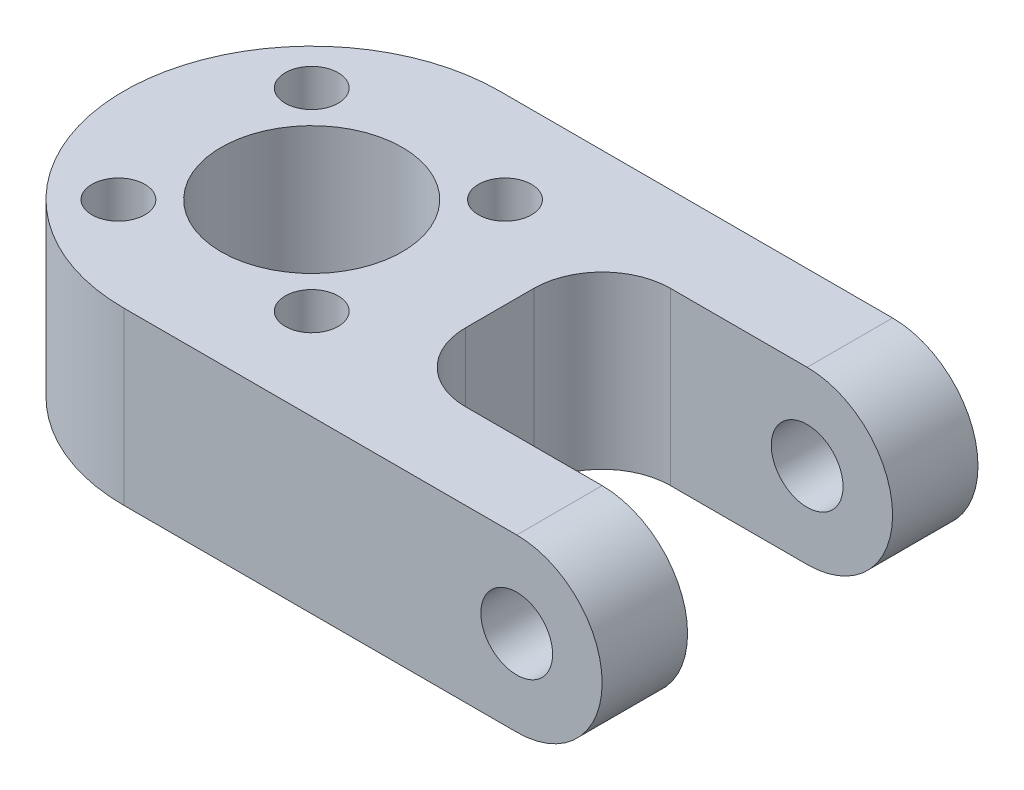
ISO-10303-21;
HEADER;
FILE_DESCRIPTION(('STEP AP214'),'2;1');
FILE_NAME('part.step','',(''),(''),'','','');
FILE_SCHEMA(('AUTOMOTIVE_DESIGN { 1 0 10303 214 1 1 1 1 }'));
ENDSEC;
DATA;
#1=APPLICATION_CONTEXT('core data for automotive mechanical design processes');
#2=APPLICATION_PROTOCOL_DEFINITION('international standard','automotive_design',2000,#1);
#3=PRODUCT_CONTEXT('',#1,'mechanical');
#4=PRODUCT('Part','Part','',(#3));
#5=PRODUCT_RELATED_PRODUCT_CATEGORY('part','',(#4));
#6=PRODUCT_DEFINITION_FORMATION('','',#4);
#7=PRODUCT_DEFINITION_CONTEXT('part definition',#1,'design');
#8=PRODUCT_DEFINITION('design','',#6,#7);
#9=PRODUCT_DEFINITION_SHAPE('','',#8);
#10=(LENGTH_UNIT() NAMED_UNIT(*) SI_UNIT(.MILLI.,.METRE.));
#11=(NAMED_UNIT(*) PLANE_ANGLE_UNIT() SI_UNIT($,.RADIAN.));
#12=(NAMED_UNIT(*) SI_UNIT($,.STERADIAN.) SOLID_ANGLE_UNIT());
#13=UNCERTAINTY_MEASURE_WITH_UNIT(LENGTH_MEASURE(1.E-05),#10,'distance_accuracy_value','');
#14=(GEOMETRIC_REPRESENTATION_CONTEXT(3) GLOBAL_UNCERTAINTY_ASSIGNED_CONTEXT((#13)) GLOBAL_UNIT_ASSIGNED_CONTEXT((#10,
#11,#12)) REPRESENTATION_CONTEXT('',''));
#15=CARTESIAN_POINT('',(0.,0.,0.));
#16=DIRECTION('',(0.,0.,1.));
#17=DIRECTION('',(1.,0.,0.));
#18=AXIS2_PLACEMENT_3D('',#15,#16,#17);
#19=CARTESIAN_POINT('',(-28.,10.,-11.0000000000001));
#20=DIRECTION('',(0.,0.,-1.));
#21=DIRECTION('',(-1.,0.,0.));
#22=AXIS2_PLACEMENT_3D('',#19,#20,#21);
#23=PLANE('',#22);
#24=CARTESIAN_POINT('',(-5.,5.,-11.0000000000001));
#25=DIRECTION('',(0.,0.,1.));
#26=DIRECTION('',(1.,0.,0.));
#27=AXIS2_PLACEMENT_3D('',#24,#25,#26);
#28=CIRCLE('',#27,2.1);
#29=CARTESIAN_POINT('',(-2.9,5.,-11.0000000000001));
#30=VERTEX_POINT('',#29);
#31=EDGE_CURVE('E519',#30,#30,#28,.T.);
#32=ORIENTED_EDGE('',*,*,#31,.T.);
#33=EDGE_LOOP('',(#32));
#34=FACE_BOUND('',#33,.T.);
#35=CARTESIAN_POINT('',(-5.,5.,-11.0000000000001));
#36=DIRECTION('',(0.,0.,1.));
#37=DIRECTION('',(1.,0.,0.));
#38=AXIS2_PLACEMENT_3D('',#35,#36,#37);
#39=CIRCLE('',#38,5.);
#40=CARTESIAN_POINT('',(-5.,0.,-11.0000000000001));
#41=VERTEX_POINT('',#40);
#42=CARTESIAN_POINT('',(-5.,10.,-11.0000000000001));
#43=VERTEX_POINT('',#42);
#44=EDGE_CURVE('E301',#41,#43,#39,.T.);
#45=ORIENTED_EDGE('',*,*,#44,.F.);
#46=DIRECTION('',(1.,0.,0.));
#47=VECTOR('',#46,1.);
#48=CARTESIAN_POINT('',(-28.,0.,-11.0000000000001));
#49=LINE('',#48,#47);
#50=CARTESIAN_POINT('',(-28.,0.,-11.0000000000001));
#51=VERTEX_POINT('',#50);
#52=EDGE_CURVE('E304',#51,#41,#49,.T.);
#53=ORIENTED_EDGE('',*,*,#52,.F.);
#54=DIRECTION('',(0.,-1.,0.));
#55=VECTOR('',#54,1.);
#56=CARTESIAN_POINT('',(-28.,10.,-11.0000000000001));
#57=LINE('',#56,#55);
#58=CARTESIAN_POINT('',(-28.,10.,-11.0000000000001));
#59=VERTEX_POINT('',#58);
#60=EDGE_CURVE('E359',#59,#51,#57,.T.);
#61=ORIENTED_EDGE('',*,*,#60,.F.);
#62=DIRECTION('',(1.,0.,0.));
#63=VECTOR('',#62,1.);
#64=CARTESIAN_POINT('',(-28.,10.,-11.0000000000001));
#65=LINE('',#64,#63);
#66=EDGE_CURVE('E306',#59,#43,#65,.T.);
#67=ORIENTED_EDGE('',*,*,#66,.T.);
#68=EDGE_LOOP('',(#45,#53,#61,#67));
#69=FACE_BOUND('',#68,.T.);
#70=ADVANCED_FACE('F223',(#34,#69),#23,.T.);
#71=CARTESIAN_POINT('',(-28.,10.,10.9999999999999));
#72=DIRECTION('',(0.,0.,-1.));
#73=DIRECTION('',(-1.,0.,0.));
#74=AXIS2_PLACEMENT_3D('',#71,#72,#73);
#75=PLANE('',#74);
#76=CARTESIAN_POINT('',(-5.,5.,10.9999999999999));
#77=DIRECTION('',(0.,0.,1.));
#78=DIRECTION('',(1.,0.,0.));
#79=AXIS2_PLACEMENT_3D('',#76,#77,#78);
#80=CIRCLE('',#79,2.1);
#81=CARTESIAN_POINT('',(-2.9,5.,10.9999999999999));
#82=VERTEX_POINT('',#81);
#83=EDGE_CURVE('E521',#82,#82,#80,.T.);
#84=ORIENTED_EDGE('',*,*,#83,.F.);
#85=EDGE_LOOP('',(#84));
#86=FACE_BOUND('',#85,.T.);
#87=DIRECTION('',(1.,0.,0.));
#88=VECTOR('',#87,1.);
#89=CARTESIAN_POINT('',(-28.,0.,10.9999999999999));
#90=LINE('',#89,#88);
#91=CARTESIAN_POINT('',(-28.,0.,10.9999999999999));
#92=VERTEX_POINT('',#91);
#93=CARTESIAN_POINT('',(-5.,0.,10.9999999999999));
#94=VERTEX_POINT('',#93);
#95=EDGE_CURVE('E353',#92,#94,#90,.T.);
#96=ORIENTED_EDGE('',*,*,#95,.T.);
#97=CARTESIAN_POINT('',(-5.,5.,10.9999999999999));
#98=DIRECTION('',(0.,0.,1.));
#99=DIRECTION('',(1.,0.,0.));
#100=AXIS2_PLACEMENT_3D('',#97,#98,#99);
#101=CIRCLE('',#100,5.);
#102=CARTESIAN_POINT('',(-5.,10.,10.9999999999999));
#103=VERTEX_POINT('',#102);
#104=EDGE_CURVE('E312',#94,#103,#101,.T.);
#105=ORIENTED_EDGE('',*,*,#104,.T.);
#106=DIRECTION('',(1.,0.,0.));
#107=VECTOR('',#106,1.);
#108=CARTESIAN_POINT('',(-28.,10.,10.9999999999999));
#109=LINE('',#108,#107);
#110=CARTESIAN_POINT('',(-28.,10.,10.9999999999999));
#111=VERTEX_POINT('',#110);
#112=EDGE_CURVE('E401',#111,#103,#109,.T.);
#113=ORIENTED_EDGE('',*,*,#112,.F.);
#114=DIRECTION('',(0.,-1.,0.));
#115=VECTOR('',#114,1.);
#116=CARTESIAN_POINT('',(-28.,10.,10.9999999999999));
#117=LINE('',#116,#115);
#118=EDGE_CURVE('E363',#111,#92,#117,.T.);
#119=ORIENTED_EDGE('',*,*,#118,.T.);
#120=EDGE_LOOP('',(#96,#105,#113,#119));
#121=FACE_BOUND('',#120,.T.);
#122=ADVANCED_FACE('F420',(#86,#121),#75,.F.);
#123=CARTESIAN_POINT('',(0.,10.,5.99999999999994));
#124=DIRECTION('',(0.,0.,1.));
#125=DIRECTION('',(1.,0.,0.));
#126=AXIS2_PLACEMENT_3D('',#123,#124,#125);
#127=PLANE('',#126);
#128=CARTESIAN_POINT('',(-5.,5.,5.99999999999994));
#129=DIRECTION('',(0.,0.,1.));
#130=DIRECTION('',(1.,0.,0.));
#131=AXIS2_PLACEMENT_3D('',#128,#129,#130);
#132=CIRCLE('',#131,2.1);
#133=CARTESIAN_POINT('',(-2.9,5.,5.99999999999994));
#134=VERTEX_POINT('',#133);
#135=EDGE_CURVE('E370',#134,#134,#132,.T.);
#136=ORIENTED_EDGE('',*,*,#135,.T.);
#137=EDGE_LOOP('',(#136));
#138=FACE_BOUND('',#137,.T.);
#139=DIRECTION('',(-1.,0.,0.));
#140=VECTOR('',#139,1.);
#141=CARTESIAN_POINT('',(0.,0.,5.99999999999994));
#142=LINE('',#141,#140);
#143=CARTESIAN_POINT('',(-5.,0.,5.99999999999994));
#144=VERTEX_POINT('',#143);
#145=CARTESIAN_POINT('',(-13.,0.,5.99999999999994));
#146=VERTEX_POINT('',#145);
#147=EDGE_CURVE('E350',#144,#146,#142,.T.);
#148=ORIENTED_EDGE('',*,*,#147,.T.);
#149=DIRECTION('',(0.,-1.,0.));
#150=VECTOR('',#149,1.);
#151=CARTESIAN_POINT('',(-13.,10.,5.99999999999994));
#152=LINE('',#151,#150);
#153=CARTESIAN_POINT('',(-13.,10.,5.99999999999994));
#154=VERTEX_POINT('',#153);
#155=EDGE_CURVE('E239',#146,#154,#152,.F.);
#156=ORIENTED_EDGE('',*,*,#155,.T.);
#157=DIRECTION('',(-1.,0.,0.));
#158=VECTOR('',#157,1.);
#159=CARTESIAN_POINT('',(0.,10.,5.99999999999994));
#160=LINE('',#159,#158);
#161=CARTESIAN_POINT('',(-5.,10.,5.99999999999994));
#162=VERTEX_POINT('',#161);
#163=EDGE_CURVE('E394',#162,#154,#160,.T.);
#164=ORIENTED_EDGE('',*,*,#163,.F.);
#165=CARTESIAN_POINT('',(-5.,5.,5.99999999999994));
#166=DIRECTION('',(0.,0.,1.));
#167=DIRECTION('',(1.,0.,0.));
#168=AXIS2_PLACEMENT_3D('',#165,#166,#167);
#169=CIRCLE('',#168,5.);
#170=EDGE_CURVE('E434',#144,#162,#169,.T.);
#171=ORIENTED_EDGE('',*,*,#170,.F.);
#172=EDGE_LOOP('',(#148,#156,#164,#171));
#173=FACE_BOUND('',#172,.T.);
#174=ADVANCED_FACE('F494',(#138,#173),#127,.F.);
#175=CARTESIAN_POINT('',(-17.,10.,-6.00000000000006));
#176=DIRECTION('',(0.,0.,-1.));
#177=DIRECTION('',(-1.,0.,0.));
#178=AXIS2_PLACEMENT_3D('',#175,#176,#177);
#179=PLANE('',#178);
#180=CARTESIAN_POINT('',(-5.,5.,-6.00000000000006));
#181=DIRECTION('',(0.,0.,-1.));
#182=DIRECTION('',(-1.,0.,0.));
#183=AXIS2_PLACEMENT_3D('',#180,#181,#182);
#184=CIRCLE('',#183,2.1);
#185=CARTESIAN_POINT('',(-7.1,5.,-6.00000000000006));
#186=VERTEX_POINT('',#185);
#187=EDGE_CURVE('E322',#186,#186,#184,.T.);
#188=ORIENTED_EDGE('',*,*,#187,.T.);
#189=EDGE_LOOP('',(#188));
#190=FACE_BOUND('',#189,.T.);
#191=DIRECTION('',(1.,0.,0.));
#192=VECTOR('',#191,1.);
#193=CARTESIAN_POINT('',(-17.,10.,-6.00000000000006));
#194=LINE('',#193,#192);
#195=CARTESIAN_POINT('',(-13.,10.,-6.00000000000006));
#196=VERTEX_POINT('',#195);
#197=CARTESIAN_POINT('',(-5.,10.,-6.00000000000006));
#198=VERTEX_POINT('',#197);
#199=EDGE_CURVE('E395',#196,#198,#194,.T.);
#200=ORIENTED_EDGE('',*,*,#199,.F.);
#201=DIRECTION('',(0.,-1.,0.));
#202=VECTOR('',#201,1.);
#203=CARTESIAN_POINT('',(-13.,0.,-6.00000000000006));
#204=LINE('',#203,#202);
#205=CARTESIAN_POINT('',(-13.,0.,-6.00000000000006));
#206=VERTEX_POINT('',#205);
#207=EDGE_CURVE('E362',#196,#206,#204,.T.);
#208=ORIENTED_EDGE('',*,*,#207,.T.);
#209=DIRECTION('',(1.,0.,0.));
#210=VECTOR('',#209,1.);
#211=CARTESIAN_POINT('',(-17.,0.,-6.00000000000006));
#212=LINE('',#211,#210);
#213=CARTESIAN_POINT('',(-5.,0.,-6.00000000000006));
#214=VERTEX_POINT('',#213);
#215=EDGE_CURVE('E331',#206,#214,#212,.T.);
#216=ORIENTED_EDGE('',*,*,#215,.T.);
#217=CARTESIAN_POINT('',(-5.,5.,-6.00000000000006));
#218=DIRECTION('',(0.,0.,-1.));
#219=DIRECTION('',(-1.,0.,0.));
#220=AXIS2_PLACEMENT_3D('',#217,#218,#219);
#221=CIRCLE('',#220,5.);
#222=EDGE_CURVE('E319',#198,#214,#221,.T.);
#223=ORIENTED_EDGE('',*,*,#222,.F.);
#224=EDGE_LOOP('',(#200,#208,#216,#223));
#225=FACE_BOUND('',#224,.T.);
#226=ADVANCED_FACE('F499',(#190,#225),#179,.F.);
#227=CARTESIAN_POINT('',(-28.,10.,0.));
#228=DIRECTION('',(0.,1.,0.));
#229=DIRECTION('',(0.,0.,1.));
#230=AXIS2_PLACEMENT_3D('',#227,#228,#229);
#231=PLANE('',#230);
#232=DIRECTION('',(0.,0.,1.));
#233=VECTOR('',#232,1.);
#234=CARTESIAN_POINT('',(-5.,10.,-11.0000000000001));
#235=LINE('',#234,#233);
#236=EDGE_CURVE('E430',#43,#198,#235,.T.);
#237=ORIENTED_EDGE('',*,*,#236,.F.);
#238=ORIENTED_EDGE('',*,*,#66,.F.);
#239=CARTESIAN_POINT('',(-28.,10.,0.));
#240=DIRECTION('',(0.,1.,0.));
#241=DIRECTION('',(0.,0.,1.));
#242=AXIS2_PLACEMENT_3D('',#239,#240,#241);
#243=CIRCLE('',#242,11.);
#244=EDGE_CURVE('E344',#59,#111,#243,.T.);
#245=ORIENTED_EDGE('',*,*,#244,.T.);
#246=ORIENTED_EDGE('',*,*,#112,.T.);
#247=EDGE_CURVE('E311',#162,#103,#235,.T.);
#248=ORIENTED_EDGE('',*,*,#247,.F.);
#249=ORIENTED_EDGE('',*,*,#163,.T.);
#250=CARTESIAN_POINT('',(-13.,10.,1.99999999999994));
#251=DIRECTION('',(0.,1.,0.));
#252=DIRECTION('',(0.,0.,1.));
#253=AXIS2_PLACEMENT_3D('',#250,#251,#252);
#254=CIRCLE('',#253,4.);
#255=CARTESIAN_POINT('',(-17.,10.,1.99999999999994));
#256=VERTEX_POINT('',#255);
#257=EDGE_CURVE('E12',#154,#256,#254,.F.);
#258=ORIENTED_EDGE('',*,*,#257,.T.);
#259=DIRECTION('',(0.,0.,-1.));
#260=VECTOR('',#259,1.);
#261=CARTESIAN_POINT('',(-17.,10.,5.99999999999994));
#262=LINE('',#261,#260);
#263=CARTESIAN_POINT('',(-17.,10.,-2.00000000000006));
#264=VERTEX_POINT('',#263);
#265=EDGE_CURVE('E392',#256,#264,#262,.T.);
#266=ORIENTED_EDGE('',*,*,#265,.T.);
#267=CARTESIAN_POINT('',(-13.,10.,-2.00000000000006));
#268=DIRECTION('',(0.,1.,0.));
#269=DIRECTION('',(0.,0.,1.));
#270=AXIS2_PLACEMENT_3D('',#267,#268,#269);
#271=CIRCLE('',#270,4.);
#272=EDGE_CURVE('E386',#264,#196,#271,.F.);
#273=ORIENTED_EDGE('',*,*,#272,.T.);
#274=ORIENTED_EDGE('',*,*,#199,.T.);
#275=EDGE_LOOP('',(#237,#238,#245,#246,#248,#249,#258,#266,#273,#274));
#276=FACE_BOUND('',#275,.T.);
#277=CARTESIAN_POINT('',(-22.3431457505076,10.,-5.65685424949245));
#278=DIRECTION('',(0.,1.,0.));
#279=DIRECTION('',(0.,0.,1.));
#280=AXIS2_PLACEMENT_3D('',#277,#278,#279);
#281=CIRCLE('',#280,1.54999999999999);
#282=CARTESIAN_POINT('',(-22.3431457505076,10.,-4.10685424949245));
#283=VERTEX_POINT('',#282);
#284=EDGE_CURVE('E445',#283,#283,#281,.T.);
#285=ORIENTED_EDGE('',*,*,#284,.F.);
#286=EDGE_LOOP('',(#285));
#287=FACE_BOUND('',#286,.T.);
#288=CARTESIAN_POINT('',(-33.6568542494924,10.,5.65685424949234));
#289=DIRECTION('',(0.,1.,0.));
#290=DIRECTION('',(0.,0.,1.));
#291=AXIS2_PLACEMENT_3D('',#288,#289,#290);
#292=CIRCLE('',#291,1.54999999999999);
#293=CARTESIAN_POINT('',(-33.6568542494924,10.,7.20685424949233));
#294=VERTEX_POINT('',#293);
#295=EDGE_CURVE('E460',#294,#294,#292,.T.);
#296=ORIENTED_EDGE('',*,*,#295,.F.);
#297=EDGE_LOOP('',(#296));
#298=FACE_BOUND('',#297,.T.);
#299=CARTESIAN_POINT('',(-28.,10.,0.));
#300=DIRECTION('',(0.,1.,0.));
#301=DIRECTION('',(0.,0.,1.));
#302=AXIS2_PLACEMENT_3D('',#299,#300,#301);
#303=CIRCLE('',#302,5.3);
#304=CARTESIAN_POINT('',(-28.,10.,5.29999999999995));
#305=VERTEX_POINT('',#304);
#306=EDGE_CURVE('E332',#305,#305,#303,.T.);
#307=ORIENTED_EDGE('',*,*,#306,.F.);
#308=EDGE_LOOP('',(#307));
#309=FACE_BOUND('',#308,.T.);
#310=CARTESIAN_POINT('',(-22.3431457505076,10.,5.65685424949231));
#311=DIRECTION('',(0.,1.,0.));
#312=DIRECTION('',(0.,0.,1.));
#313=AXIS2_PLACEMENT_3D('',#310,#311,#312);
#314=CIRCLE('',#313,1.55);
#315=CARTESIAN_POINT('',(-22.3431457505076,10.,7.20685424949232));
#316=VERTEX_POINT('',#315);
#317=EDGE_CURVE('E453',#316,#316,#314,.T.);
#318=ORIENTED_EDGE('',*,*,#317,.F.);
#319=EDGE_LOOP('',(#318));
#320=FACE_BOUND('',#319,.T.);
#321=CARTESIAN_POINT('',(-33.6568542494924,10.,-5.65685424949241));
#322=DIRECTION('',(0.,1.,0.));
#323=DIRECTION('',(0.,0.,1.));
#324=AXIS2_PLACEMENT_3D('',#321,#322,#323);
#325=CIRCLE('',#324,1.54999999999999);
#326=CARTESIAN_POINT('',(-33.6568542494924,10.,-4.10685424949243));
#327=VERTEX_POINT('',#326);
#328=EDGE_CURVE('E438',#327,#327,#325,.T.);
#329=ORIENTED_EDGE('',*,*,#328,.F.);
#330=EDGE_LOOP('',(#329));
#331=FACE_BOUND('',#330,.T.);
#332=ADVANCED_FACE('F414',(#276,#287,#298,#309,#320,#331),#231,.T.);
#333=CARTESIAN_POINT('',(-28.,0.,0.));
#334=DIRECTION('',(0.,1.,0.));
#335=DIRECTION('',(0.,0.,1.));
#336=AXIS2_PLACEMENT_3D('',#333,#334,#335);
#337=PLANE('',#336);
#338=ORIENTED_EDGE('',*,*,#52,.T.);
#339=DIRECTION('',(0.,0.,1.));
#340=VECTOR('',#339,1.);
#341=CARTESIAN_POINT('',(-5.,0.,-11.0000000000001));
#342=LINE('',#341,#340);
#343=EDGE_CURVE('E316',#41,#214,#342,.T.);
#344=ORIENTED_EDGE('',*,*,#343,.T.);
#345=ORIENTED_EDGE('',*,*,#215,.F.);
#346=CARTESIAN_POINT('',(-13.,0.,-2.00000000000006));
#347=DIRECTION('',(0.,1.,0.));
#348=DIRECTION('',(0.,0.,1.));
#349=AXIS2_PLACEMENT_3D('',#346,#347,#348);
#350=CIRCLE('',#349,4.);
#351=CARTESIAN_POINT('',(-17.,0.,-2.00000000000006));
#352=VERTEX_POINT('',#351);
#353=EDGE_CURVE('E383',#206,#352,#350,.T.);
#354=ORIENTED_EDGE('',*,*,#353,.T.);
#355=DIRECTION('',(0.,0.,-1.));
#356=VECTOR('',#355,1.);
#357=CARTESIAN_POINT('',(-17.,0.,5.99999999999994));
#358=LINE('',#357,#356);
#359=CARTESIAN_POINT('',(-17.,0.,1.99999999999994));
#360=VERTEX_POINT('',#359);
#361=EDGE_CURVE('E337',#360,#352,#358,.T.);
#362=ORIENTED_EDGE('',*,*,#361,.F.);
#363=CARTESIAN_POINT('',(-13.,0.,1.99999999999994));
#364=DIRECTION('',(0.,1.,0.));
#365=DIRECTION('',(0.,0.,1.));
#366=AXIS2_PLACEMENT_3D('',#363,#364,#365);
#367=CIRCLE('',#366,4.);
#368=EDGE_CURVE('E232',#360,#146,#367,.T.);
#369=ORIENTED_EDGE('',*,*,#368,.T.);
#370=ORIENTED_EDGE('',*,*,#147,.F.);
#371=EDGE_CURVE('E323',#144,#94,#342,.T.);
#372=ORIENTED_EDGE('',*,*,#371,.T.);
#373=ORIENTED_EDGE('',*,*,#95,.F.);
#374=CARTESIAN_POINT('',(-28.,0.,0.));
#375=DIRECTION('',(0.,1.,0.));
#376=DIRECTION('',(0.,0.,1.));
#377=AXIS2_PLACEMENT_3D('',#374,#375,#376);
#378=CIRCLE('',#377,11.);
#379=EDGE_CURVE('E329',#51,#92,#378,.T.);
#380=ORIENTED_EDGE('',*,*,#379,.F.);
#381=EDGE_LOOP('',(#338,#344,#345,#354,#362,#369,#370,#372,#373,#380));
#382=FACE_BOUND('',#381,.T.);
#383=CARTESIAN_POINT('',(-28.,0.,0.));
#384=DIRECTION('',(0.,1.,0.));
#385=DIRECTION('',(0.,0.,1.));
#386=AXIS2_PLACEMENT_3D('',#383,#384,#385);
#387=CIRCLE('',#386,5.3);
#388=CARTESIAN_POINT('',(-28.,0.,5.29999999999995));
#389=VERTEX_POINT('',#388);
#390=EDGE_CURVE('E341',#389,#389,#387,.T.);
#391=ORIENTED_EDGE('',*,*,#390,.T.);
#392=EDGE_LOOP('',(#391));
#393=FACE_BOUND('',#392,.T.);
#394=CARTESIAN_POINT('',(-33.6568542494924,0.,5.65685424949234));
#395=DIRECTION('',(0.,1.,0.));
#396=DIRECTION('',(0.,0.,1.));
#397=AXIS2_PLACEMENT_3D('',#394,#395,#396);
#398=CIRCLE('',#397,1.54999999999999);
#399=CARTESIAN_POINT('',(-33.6568542494924,0.,7.20685424949233));
#400=VERTEX_POINT('',#399);
#401=EDGE_CURVE('E456',#400,#400,#398,.T.);
#402=ORIENTED_EDGE('',*,*,#401,.T.);
#403=EDGE_LOOP('',(#402));
#404=FACE_BOUND('',#403,.T.);
#405=CARTESIAN_POINT('',(-22.3431457505076,0.,5.65685424949231));
#406=DIRECTION('',(0.,1.,0.));
#407=DIRECTION('',(0.,0.,1.));
#408=AXIS2_PLACEMENT_3D('',#405,#406,#407);
#409=CIRCLE('',#408,1.55);
#410=CARTESIAN_POINT('',(-22.3431457505076,0.,7.20685424949232));
#411=VERTEX_POINT('',#410);
#412=EDGE_CURVE('E449',#411,#411,#409,.T.);
#413=ORIENTED_EDGE('',*,*,#412,.T.);
#414=EDGE_LOOP('',(#413));
#415=FACE_BOUND('',#414,.T.);
#416=CARTESIAN_POINT('',(-22.3431457505076,0.,-5.65685424949245));
#417=DIRECTION('',(0.,1.,0.));
#418=DIRECTION('',(0.,0.,1.));
#419=AXIS2_PLACEMENT_3D('',#416,#417,#418);
#420=CIRCLE('',#419,1.54999999999999);
#421=CARTESIAN_POINT('',(-22.3431457505076,0.,-4.10685424949245));
#422=VERTEX_POINT('',#421);
#423=EDGE_CURVE('E442',#422,#422,#420,.T.);
#424=ORIENTED_EDGE('',*,*,#423,.T.);
#425=EDGE_LOOP('',(#424));
#426=FACE_BOUND('',#425,.T.);
#427=CARTESIAN_POINT('',(-33.6568542494924,0.,-5.65685424949241));
#428=DIRECTION('',(0.,1.,0.));
#429=DIRECTION('',(0.,0.,1.));
#430=AXIS2_PLACEMENT_3D('',#427,#428,#429);
#431=CIRCLE('',#430,1.54999999999999);
#432=CARTESIAN_POINT('',(-33.6568542494924,0.,-4.10685424949243));
#433=VERTEX_POINT('',#432);
#434=EDGE_CURVE('E437',#433,#433,#431,.T.);
#435=ORIENTED_EDGE('',*,*,#434,.T.);
#436=EDGE_LOOP('',(#435));
#437=FACE_BOUND('',#436,.T.);
#438=ADVANCED_FACE('F326',(#382,#393,#404,#415,#426,#437),#337,.F.);
#439=CARTESIAN_POINT('',(-28.,10.,0.));
#440=DIRECTION('',(0.,-1.,0.));
#441=DIRECTION('',(0.,0.,-1.));
#442=AXIS2_PLACEMENT_3D('',#439,#440,#441);
#443=CYLINDRICAL_SURFACE('',#442,11.);
#444=ORIENTED_EDGE('',*,*,#379,.T.);
#445=ORIENTED_EDGE('',*,*,#118,.F.);
#446=ORIENTED_EDGE('',*,*,#244,.F.);
#447=ORIENTED_EDGE('',*,*,#60,.T.);
#448=EDGE_LOOP('',(#444,#445,#446,#447));
#449=FACE_BOUND('',#448,.T.);
#450=ADVANCED_FACE('F417',(#449),#443,.T.);
#451=CARTESIAN_POINT('',(-17.,10.,5.99999999999994));
#452=DIRECTION('',(-1.,0.,0.));
#453=DIRECTION('',(0.,0.,1.));
#454=AXIS2_PLACEMENT_3D('',#451,#452,#453);
#455=PLANE('',#454);
#456=ORIENTED_EDGE('',*,*,#361,.T.);
#457=DIRECTION('',(0.,-1.,0.));
#458=VECTOR('',#457,1.);
#459=CARTESIAN_POINT('',(-17.,10.,-2.00000000000006));
#460=LINE('',#459,#458);
#461=EDGE_CURVE('E378',#352,#264,#460,.F.);
#462=ORIENTED_EDGE('',*,*,#461,.T.);
#463=ORIENTED_EDGE('',*,*,#265,.F.);
#464=DIRECTION('',(0.,-1.,0.));
#465=VECTOR('',#464,1.);
#466=CARTESIAN_POINT('',(-17.,0.,1.99999999999994));
#467=LINE('',#466,#465);
#468=EDGE_CURVE('E374',#256,#360,#467,.T.);
#469=ORIENTED_EDGE('',*,*,#468,.T.);
#470=EDGE_LOOP('',(#456,#462,#463,#469));
#471=FACE_BOUND('',#470,.T.);
#472=ADVANCED_FACE('F475',(#471),#455,.F.);
#473=CARTESIAN_POINT('',(-28.,10.,0.));
#474=DIRECTION('',(0.,-1.,0.));
#475=DIRECTION('',(0.,0.,-1.));
#476=AXIS2_PLACEMENT_3D('',#473,#474,#475);
#477=CYLINDRICAL_SURFACE('',#476,5.3);
#478=ORIENTED_EDGE('',*,*,#306,.T.);
#479=EDGE_LOOP('',(#478));
#480=FACE_BOUND('',#479,.T.);
#481=ORIENTED_EDGE('',*,*,#390,.F.);
#482=EDGE_LOOP('',(#481));
#483=FACE_BOUND('',#482,.T.);
#484=ADVANCED_FACE('F472',(#480,#483),#477,.F.);
#485=CARTESIAN_POINT('',(-33.6568542494924,10.,5.65685424949234));
#486=DIRECTION('',(0.,-1.,0.));
#487=DIRECTION('',(0.,0.,-1.));
#488=AXIS2_PLACEMENT_3D('',#485,#486,#487);
#489=CYLINDRICAL_SURFACE('',#488,1.54999999999999);
#490=ORIENTED_EDGE('',*,*,#295,.T.);
#491=EDGE_LOOP('',(#490));
#492=FACE_BOUND('',#491,.T.);
#493=ORIENTED_EDGE('',*,*,#401,.F.);
#494=EDGE_LOOP('',(#493));
#495=FACE_BOUND('',#494,.T.);
#496=ADVANCED_FACE('F474',(#492,#495),#489,.F.);
#497=CARTESIAN_POINT('',(-22.3431457505076,10.,5.65685424949231));
#498=DIRECTION('',(0.,-1.,0.));
#499=DIRECTION('',(0.,0.,-1.));
#500=AXIS2_PLACEMENT_3D('',#497,#498,#499);
#501=CYLINDRICAL_SURFACE('',#500,1.55);
#502=ORIENTED_EDGE('',*,*,#317,.T.);
#503=EDGE_LOOP('',(#502));
#504=FACE_BOUND('',#503,.T.);
#505=ORIENTED_EDGE('',*,*,#412,.F.);
#506=EDGE_LOOP('',(#505));
#507=FACE_BOUND('',#506,.T.);
#508=ADVANCED_FACE('F482',(#504,#507),#501,.F.);
#509=CARTESIAN_POINT('',(-22.3431457505076,10.,-5.65685424949245));
#510=DIRECTION('',(0.,-1.,0.));
#511=DIRECTION('',(0.,0.,-1.));
#512=AXIS2_PLACEMENT_3D('',#509,#510,#511);
#513=CYLINDRICAL_SURFACE('',#512,1.54999999999999);
#514=ORIENTED_EDGE('',*,*,#284,.T.);
#515=EDGE_LOOP('',(#514));
#516=FACE_BOUND('',#515,.T.);
#517=ORIENTED_EDGE('',*,*,#423,.F.);
#518=EDGE_LOOP('',(#517));
#519=FACE_BOUND('',#518,.T.);
#520=ADVANCED_FACE('F570',(#516,#519),#513,.F.);
#521=CARTESIAN_POINT('',(-33.6568542494924,10.,-5.65685424949241));
#522=DIRECTION('',(0.,-1.,0.));
#523=DIRECTION('',(0.,0.,-1.));
#524=AXIS2_PLACEMENT_3D('',#521,#522,#523);
#525=CYLINDRICAL_SURFACE('',#524,1.54999999999999);
#526=ORIENTED_EDGE('',*,*,#328,.T.);
#527=EDGE_LOOP('',(#526));
#528=FACE_BOUND('',#527,.T.);
#529=ORIENTED_EDGE('',*,*,#434,.F.);
#530=EDGE_LOOP('',(#529));
#531=FACE_BOUND('',#530,.T.);
#532=ADVANCED_FACE('F579',(#528,#531),#525,.F.);
#533=CARTESIAN_POINT('',(-5.,5.,-11.0000000000001));
#534=DIRECTION('',(0.,0.,1.));
#535=DIRECTION('',(1.,0.,0.));
#536=AXIS2_PLACEMENT_3D('',#533,#534,#535);
#537=CYLINDRICAL_SURFACE('',#536,5.);
#538=ORIENTED_EDGE('',*,*,#222,.T.);
#539=ORIENTED_EDGE('',*,*,#343,.F.);
#540=ORIENTED_EDGE('',*,*,#44,.T.);
#541=ORIENTED_EDGE('',*,*,#236,.T.);
#542=EDGE_LOOP('',(#538,#539,#540,#541));
#543=FACE_BOUND('',#542,.T.);
#544=ADVANCED_FACE('F317',(#543),#537,.T.);
#545=ORIENTED_EDGE('',*,*,#170,.T.);
#546=ORIENTED_EDGE('',*,*,#247,.T.);
#547=ORIENTED_EDGE('',*,*,#104,.F.);
#548=ORIENTED_EDGE('',*,*,#371,.F.);
#549=EDGE_LOOP('',(#545,#546,#547,#548));
#550=FACE_BOUND('',#549,.T.);
#551=ADVANCED_FACE('F518',(#550),#537,.T.);
#552=CARTESIAN_POINT('',(-5.,5.,-11.0000000000001));
#553=DIRECTION('',(0.,0.,1.));
#554=DIRECTION('',(1.,0.,0.));
#555=AXIS2_PLACEMENT_3D('',#552,#553,#554);
#556=CYLINDRICAL_SURFACE('',#555,2.1);
#557=ORIENTED_EDGE('',*,*,#31,.F.);
#558=EDGE_LOOP('',(#557));
#559=FACE_BOUND('',#558,.T.);
#560=ORIENTED_EDGE('',*,*,#187,.F.);
#561=EDGE_LOOP('',(#560));
#562=FACE_BOUND('',#561,.T.);
#563=ADVANCED_FACE('F509',(#559,#562),#556,.F.);
#564=ORIENTED_EDGE('',*,*,#83,.T.);
#565=EDGE_LOOP('',(#564));
#566=FACE_BOUND('',#565,.T.);
#567=ORIENTED_EDGE('',*,*,#135,.F.);
#568=EDGE_LOOP('',(#567));
#569=FACE_BOUND('',#568,.T.);
#570=ADVANCED_FACE('F502',(#566,#569),#556,.F.);
#571=CARTESIAN_POINT('',(-13.,10.,-2.00000000000006));
#572=DIRECTION('',(0.,1.,0.));
#573=DIRECTION('',(0.,0.,1.));
#574=AXIS2_PLACEMENT_3D('',#571,#572,#573);
#575=CYLINDRICAL_SURFACE('',#574,4.);
#576=ORIENTED_EDGE('',*,*,#272,.F.);
#577=ORIENTED_EDGE('',*,*,#461,.F.);
#578=ORIENTED_EDGE('',*,*,#353,.F.);
#579=ORIENTED_EDGE('',*,*,#207,.F.);
#580=EDGE_LOOP('',(#576,#577,#578,#579));
#581=FACE_BOUND('',#580,.T.);
#582=ADVANCED_FACE('F500',(#581),#575,.F.);
#583=CARTESIAN_POINT('',(-13.,10.,1.99999999999994));
#584=DIRECTION('',(0.,1.,0.));
#585=DIRECTION('',(0.,0.,1.));
#586=AXIS2_PLACEMENT_3D('',#583,#584,#585);
#587=CYLINDRICAL_SURFACE('',#586,4.);
#588=ORIENTED_EDGE('',*,*,#257,.F.);
#589=ORIENTED_EDGE('',*,*,#155,.F.);
#590=ORIENTED_EDGE('',*,*,#368,.F.);
#591=ORIENTED_EDGE('',*,*,#468,.F.);
#592=EDGE_LOOP('',(#588,#589,#590,#591));
#593=FACE_BOUND('',#592,.T.);
#594=ADVANCED_FACE('F225',(#593),#587,.F.);
#595=CLOSED_SHELL('',(#70,#122,#174,#226,#332,#438,#450,#472,#484,#496,#508,#520,#532,#544,#551,
#563,#570,#582,#594));
#596=MANIFOLD_SOLID_BREP('B2',#595);
#597=ADVANCED_BREP_SHAPE_REPRESENTATION('',(#18,#596),#14);
#598=SHAPE_DEFINITION_REPRESENTATION(#9,#597);
ENDSEC;
END-ISO-10303-21;
